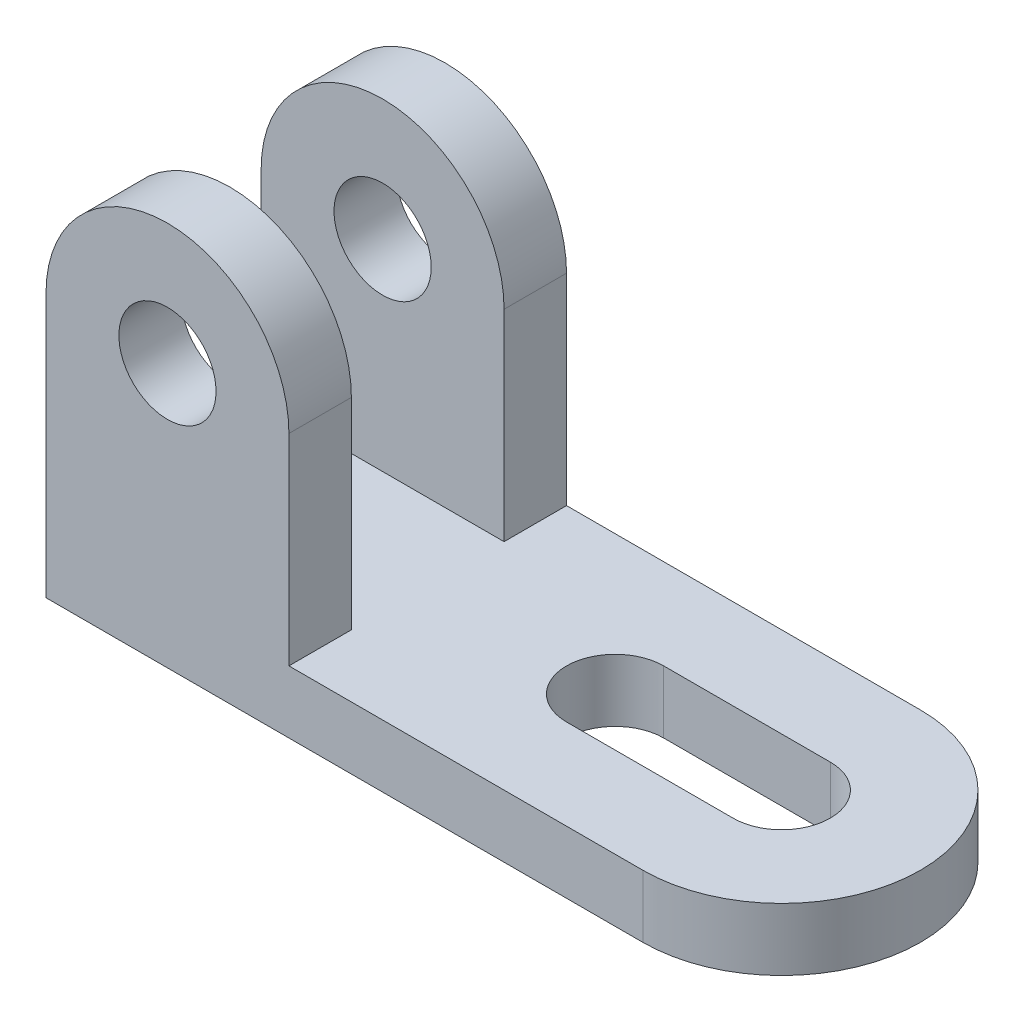
ISO-10303-21;
HEADER;
FILE_DESCRIPTION(('STEP AP214'),'2;1');
FILE_NAME('part.step','',(''),(''),'','','');
FILE_SCHEMA(('AUTOMOTIVE_DESIGN { 1 0 10303 214 1 1 1 1 }'));
ENDSEC;
DATA;
#1=APPLICATION_CONTEXT('core data for automotive mechanical design processes');
#2=APPLICATION_PROTOCOL_DEFINITION('international standard','automotive_design',2000,#1);
#3=PRODUCT_CONTEXT('',#1,'mechanical');
#4=PRODUCT('Part','Part','',(#3));
#5=PRODUCT_RELATED_PRODUCT_CATEGORY('part','',(#4));
#6=PRODUCT_DEFINITION_FORMATION('','',#4);
#7=PRODUCT_DEFINITION_CONTEXT('part definition',#1,'design');
#8=PRODUCT_DEFINITION('design','',#6,#7);
#9=PRODUCT_DEFINITION_SHAPE('','',#8);
#10=(LENGTH_UNIT() NAMED_UNIT(*) SI_UNIT(.MILLI.,.METRE.));
#11=(NAMED_UNIT(*) PLANE_ANGLE_UNIT() SI_UNIT($,.RADIAN.));
#12=(NAMED_UNIT(*) SI_UNIT($,.STERADIAN.) SOLID_ANGLE_UNIT());
#13=UNCERTAINTY_MEASURE_WITH_UNIT(LENGTH_MEASURE(1.E-05),#10,'distance_accuracy_value','');
#14=(GEOMETRIC_REPRESENTATION_CONTEXT(3) GLOBAL_UNCERTAINTY_ASSIGNED_CONTEXT((#13)) GLOBAL_UNIT_ASSIGNED_CONTEXT((#10,
#11,#12)) REPRESENTATION_CONTEXT('',''));
#15=CARTESIAN_POINT('',(0.,0.,0.));
#16=DIRECTION('',(0.,0.,1.));
#17=DIRECTION('',(1.,0.,0.));
#18=AXIS2_PLACEMENT_3D('',#15,#16,#17);
#19=CARTESIAN_POINT('',(0.,9.,0.));
#20=DIRECTION('',(0.,1.,0.));
#21=DIRECTION('',(0.,0.,1.));
#22=AXIS2_PLACEMENT_3D('',#19,#20,#21);
#23=PLANE('',#22);
#24=DIRECTION('',(1.,0.,0.));
#25=VECTOR('',#24,1.);
#26=CARTESIAN_POINT('',(0.,9.,-11.));
#27=LINE('',#26,#25);
#28=CARTESIAN_POINT('',(-86.,9.,-11.));
#29=VERTEX_POINT('',#28);
#30=CARTESIAN_POINT('',(-51.,9.,-11.));
#31=VERTEX_POINT('',#30);
#32=EDGE_CURVE('E188',#29,#31,#27,.T.);
#33=ORIENTED_EDGE('',*,*,#32,.F.);
#34=DIRECTION('',(0.,0.,1.));
#35=VECTOR('',#34,1.);
#36=CARTESIAN_POINT('',(-86.,9.,-20.));
#37=LINE('',#36,#35);
#38=CARTESIAN_POINT('',(-86.,9.,11.));
#39=VERTEX_POINT('',#38);
#40=EDGE_CURVE('E172',#29,#39,#37,.T.);
#41=ORIENTED_EDGE('',*,*,#40,.T.);
#42=DIRECTION('',(-1.,0.,0.));
#43=VECTOR('',#42,1.);
#44=CARTESIAN_POINT('',(0.,9.,11.));
#45=LINE('',#44,#43);
#46=CARTESIAN_POINT('',(-51.,9.,11.));
#47=VERTEX_POINT('',#46);
#48=EDGE_CURVE('E231',#47,#39,#45,.T.);
#49=ORIENTED_EDGE('',*,*,#48,.F.);
#50=DIRECTION('',(0.,0.,-1.));
#51=VECTOR('',#50,1.);
#52=CARTESIAN_POINT('',(-51.,9.,0.));
#53=LINE('',#52,#51);
#54=CARTESIAN_POINT('',(-51.,9.,20.));
#55=VERTEX_POINT('',#54);
#56=EDGE_CURVE('E224',#55,#47,#53,.T.);
#57=ORIENTED_EDGE('',*,*,#56,.F.);
#58=DIRECTION('',(1.,0.,0.));
#59=VECTOR('',#58,1.);
#60=CARTESIAN_POINT('',(0.,9.,20.));
#61=LINE('',#60,#59);
#62=CARTESIAN_POINT('',(0.,9.,20.));
#63=VERTEX_POINT('',#62);
#64=EDGE_CURVE('E287',#55,#63,#61,.T.);
#65=ORIENTED_EDGE('',*,*,#64,.T.);
#66=CARTESIAN_POINT('',(0.,9.,0.));
#67=DIRECTION('',(0.,1.,0.));
#68=DIRECTION('',(0.,0.,1.));
#69=AXIS2_PLACEMENT_3D('',#66,#67,#68);
#70=CIRCLE('',#69,20.);
#71=CARTESIAN_POINT('',(0.,9.,-20.));
#72=VERTEX_POINT('',#71);
#73=EDGE_CURVE('E279',#63,#72,#70,.T.);
#74=ORIENTED_EDGE('',*,*,#73,.T.);
#75=DIRECTION('',(-1.,0.,0.));
#76=VECTOR('',#75,1.);
#77=CARTESIAN_POINT('',(0.,9.,-20.));
#78=LINE('',#77,#76);
#79=CARTESIAN_POINT('',(-51.,9.,-20.));
#80=VERTEX_POINT('',#79);
#81=EDGE_CURVE('E66',#72,#80,#78,.T.);
#82=ORIENTED_EDGE('',*,*,#81,.T.);
#83=DIRECTION('',(0.,0.,1.));
#84=VECTOR('',#83,1.);
#85=CARTESIAN_POINT('',(-51.,9.,0.));
#86=LINE('',#85,#84);
#87=EDGE_CURVE('E61',#80,#31,#86,.T.);
#88=ORIENTED_EDGE('',*,*,#87,.T.);
#89=EDGE_LOOP('',(#33,#41,#49,#57,#65,#74,#82,#88));
#90=FACE_BOUND('',#89,.T.);
#91=DIRECTION('',(1.,0.,0.));
#92=VECTOR('',#91,1.);
#93=CARTESIAN_POINT('',(-24.,9.,7.));
#94=LINE('',#93,#92);
#95=CARTESIAN_POINT('',(-24.,9.,7.));
#96=VERTEX_POINT('',#95);
#97=CARTESIAN_POINT('',(0.,9.,7.));
#98=VERTEX_POINT('',#97);
#99=EDGE_CURVE('E239',#96,#98,#94,.T.);
#100=ORIENTED_EDGE('',*,*,#99,.F.);
#101=CARTESIAN_POINT('',(-24.,9.,0.));
#102=DIRECTION('',(0.,1.,0.));
#103=DIRECTION('',(0.,0.,1.));
#104=AXIS2_PLACEMENT_3D('',#101,#102,#103);
#105=CIRCLE('',#104,7.);
#106=CARTESIAN_POINT('',(-24.,9.,-7.));
#107=VERTEX_POINT('',#106);
#108=EDGE_CURVE('E236',#107,#96,#105,.T.);
#109=ORIENTED_EDGE('',*,*,#108,.F.);
#110=DIRECTION('',(-1.,0.,0.));
#111=VECTOR('',#110,1.);
#112=CARTESIAN_POINT('',(-24.,9.,-7.));
#113=LINE('',#112,#111);
#114=CARTESIAN_POINT('',(0.,9.,-7.));
#115=VERTEX_POINT('',#114);
#116=EDGE_CURVE('E247',#115,#107,#113,.T.);
#117=ORIENTED_EDGE('',*,*,#116,.F.);
#118=CARTESIAN_POINT('',(0.,9.,0.));
#119=DIRECTION('',(0.,1.,0.));
#120=DIRECTION('',(0.,0.,-1.));
#121=AXIS2_PLACEMENT_3D('',#118,#119,#120);
#122=CIRCLE('',#121,7.);
#123=EDGE_CURVE('E243',#98,#115,#122,.T.);
#124=ORIENTED_EDGE('',*,*,#123,.F.);
#125=EDGE_LOOP('',(#100,#109,#117,#124));
#126=FACE_BOUND('',#125,.T.);
#127=ADVANCED_FACE('F45',(#90,#126),#23,.T.);
#128=CARTESIAN_POINT('',(0.,0.,0.));
#129=DIRECTION('',(0.,1.,0.));
#130=DIRECTION('',(0.,0.,1.));
#131=AXIS2_PLACEMENT_3D('',#128,#129,#130);
#132=PLANE('',#131);
#133=DIRECTION('',(1.,0.,0.));
#134=VECTOR('',#133,1.);
#135=CARTESIAN_POINT('',(0.,0.,20.));
#136=LINE('',#135,#134);
#137=CARTESIAN_POINT('',(-86.,0.,20.));
#138=VERTEX_POINT('',#137);
#139=CARTESIAN_POINT('',(0.,0.,20.));
#140=VERTEX_POINT('',#139);
#141=EDGE_CURVE('E282',#138,#140,#136,.T.);
#142=ORIENTED_EDGE('',*,*,#141,.F.);
#143=DIRECTION('',(0.,0.,1.));
#144=VECTOR('',#143,1.);
#145=CARTESIAN_POINT('',(-86.,0.,-20.));
#146=LINE('',#145,#144);
#147=CARTESIAN_POINT('',(-86.,0.,-20.));
#148=VERTEX_POINT('',#147);
#149=EDGE_CURVE('E297',#148,#138,#146,.T.);
#150=ORIENTED_EDGE('',*,*,#149,.F.);
#151=DIRECTION('',(-1.,0.,0.));
#152=VECTOR('',#151,1.);
#153=CARTESIAN_POINT('',(0.,0.,-20.));
#154=LINE('',#153,#152);
#155=CARTESIAN_POINT('',(0.,0.,-20.));
#156=VERTEX_POINT('',#155);
#157=EDGE_CURVE('E294',#156,#148,#154,.T.);
#158=ORIENTED_EDGE('',*,*,#157,.F.);
#159=CARTESIAN_POINT('',(0.,0.,0.));
#160=DIRECTION('',(0.,1.,0.));
#161=DIRECTION('',(0.,0.,1.));
#162=AXIS2_PLACEMENT_3D('',#159,#160,#161);
#163=CIRCLE('',#162,20.);
#164=EDGE_CURVE('E278',#140,#156,#163,.T.);
#165=ORIENTED_EDGE('',*,*,#164,.F.);
#166=EDGE_LOOP('',(#142,#150,#158,#165));
#167=FACE_BOUND('',#166,.T.);
#168=CARTESIAN_POINT('',(-24.,0.,0.));
#169=DIRECTION('',(0.,1.,0.));
#170=DIRECTION('',(0.,0.,1.));
#171=AXIS2_PLACEMENT_3D('',#168,#169,#170);
#172=CIRCLE('',#171,7.);
#173=CARTESIAN_POINT('',(-24.,0.,-7.));
#174=VERTEX_POINT('',#173);
#175=CARTESIAN_POINT('',(-24.,0.,7.));
#176=VERTEX_POINT('',#175);
#177=EDGE_CURVE('E235',#174,#176,#172,.T.);
#178=ORIENTED_EDGE('',*,*,#177,.T.);
#179=DIRECTION('',(1.,0.,0.));
#180=VECTOR('',#179,1.);
#181=CARTESIAN_POINT('',(-24.,0.,7.));
#182=LINE('',#181,#180);
#183=CARTESIAN_POINT('',(0.,0.,7.));
#184=VERTEX_POINT('',#183);
#185=EDGE_CURVE('E254',#176,#184,#182,.T.);
#186=ORIENTED_EDGE('',*,*,#185,.T.);
#187=CARTESIAN_POINT('',(0.,0.,0.));
#188=DIRECTION('',(0.,1.,0.));
#189=DIRECTION('',(0.,0.,-1.));
#190=AXIS2_PLACEMENT_3D('',#187,#188,#189);
#191=CIRCLE('',#190,7.);
#192=CARTESIAN_POINT('',(0.,0.,-7.));
#193=VERTEX_POINT('',#192);
#194=EDGE_CURVE('E258',#184,#193,#191,.T.);
#195=ORIENTED_EDGE('',*,*,#194,.T.);
#196=DIRECTION('',(-1.,0.,0.));
#197=VECTOR('',#196,1.);
#198=CARTESIAN_POINT('',(-24.,0.,-7.));
#199=LINE('',#198,#197);
#200=EDGE_CURVE('E240',#193,#174,#199,.T.);
#201=ORIENTED_EDGE('',*,*,#200,.T.);
#202=EDGE_LOOP('',(#178,#186,#195,#201));
#203=FACE_BOUND('',#202,.T.);
#204=ADVANCED_FACE('F313',(#167,#203),#132,.F.);
#205=CARTESIAN_POINT('',(0.,9.,0.));
#206=DIRECTION('',(0.,-1.,0.));
#207=DIRECTION('',(0.,0.,-1.));
#208=AXIS2_PLACEMENT_3D('',#205,#206,#207);
#209=CYLINDRICAL_SURFACE('',#208,20.);
#210=ORIENTED_EDGE('',*,*,#164,.T.);
#211=DIRECTION('',(0.,-1.,0.));
#212=VECTOR('',#211,1.);
#213=CARTESIAN_POINT('',(0.,9.,-20.));
#214=LINE('',#213,#212);
#215=EDGE_CURVE('E11',#72,#156,#214,.T.);
#216=ORIENTED_EDGE('',*,*,#215,.F.);
#217=ORIENTED_EDGE('',*,*,#73,.F.);
#218=DIRECTION('',(0.,-1.,0.));
#219=VECTOR('',#218,1.);
#220=CARTESIAN_POINT('',(0.,9.,20.));
#221=LINE('',#220,#219);
#222=EDGE_CURVE('E290',#63,#140,#221,.T.);
#223=ORIENTED_EDGE('',*,*,#222,.T.);
#224=EDGE_LOOP('',(#210,#216,#217,#223));
#225=FACE_BOUND('',#224,.T.);
#226=ADVANCED_FACE('F47',(#225),#209,.T.);
#227=CARTESIAN_POINT('',(0.,9.,-20.));
#228=DIRECTION('',(0.,0.,1.));
#229=DIRECTION('',(1.,0.,0.));
#230=AXIS2_PLACEMENT_3D('',#227,#228,#229);
#231=PLANE('',#230);
#232=DIRECTION('',(0.,-1.,0.));
#233=VECTOR('',#232,1.);
#234=CARTESIAN_POINT('',(-86.,9.,-20.));
#235=LINE('',#234,#233);
#236=CARTESIAN_POINT('',(-86.,38.,-20.));
#237=VERTEX_POINT('',#236);
#238=EDGE_CURVE('E54',#237,#148,#235,.T.);
#239=ORIENTED_EDGE('',*,*,#238,.F.);
#240=CARTESIAN_POINT('',(-68.5,38.,-20.));
#241=DIRECTION('',(0.,0.,1.));
#242=DIRECTION('',(-1.,0.,0.));
#243=AXIS2_PLACEMENT_3D('',#240,#241,#242);
#244=CIRCLE('',#243,17.5);
#245=CARTESIAN_POINT('',(-51.,38.,-20.));
#246=VERTEX_POINT('',#245);
#247=EDGE_CURVE('E164',#246,#237,#244,.T.);
#248=ORIENTED_EDGE('',*,*,#247,.F.);
#249=DIRECTION('',(0.,1.,0.));
#250=VECTOR('',#249,1.);
#251=CARTESIAN_POINT('',(-51.,38.,-20.));
#252=LINE('',#251,#250);
#253=EDGE_CURVE('E174',#80,#246,#252,.T.);
#254=ORIENTED_EDGE('',*,*,#253,.F.);
#255=ORIENTED_EDGE('',*,*,#81,.F.);
#256=ORIENTED_EDGE('',*,*,#215,.T.);
#257=ORIENTED_EDGE('',*,*,#157,.T.);
#258=EDGE_LOOP('',(#239,#248,#254,#255,#256,#257));
#259=FACE_BOUND('',#258,.T.);
#260=CARTESIAN_POINT('',(-68.5,38.,-20.));
#261=DIRECTION('',(0.,0.,1.));
#262=DIRECTION('',(1.,0.,0.));
#263=AXIS2_PLACEMENT_3D('',#260,#261,#262);
#264=CIRCLE('',#263,7.);
#265=CARTESIAN_POINT('',(-61.5,38.,-20.));
#266=VERTEX_POINT('',#265);
#267=EDGE_CURVE('E179',#266,#266,#264,.T.);
#268=ORIENTED_EDGE('',*,*,#267,.T.);
#269=EDGE_LOOP('',(#268));
#270=FACE_BOUND('',#269,.T.);
#271=ADVANCED_FACE('F340',(#259,#270),#231,.F.);
#272=CARTESIAN_POINT('',(-86.,9.,-20.));
#273=DIRECTION('',(1.,0.,0.));
#274=DIRECTION('',(0.,0.,-1.));
#275=AXIS2_PLACEMENT_3D('',#272,#273,#274);
#276=PLANE('',#275);
#277=ORIENTED_EDGE('',*,*,#40,.F.);
#278=DIRECTION('',(0.,-1.,0.));
#279=VECTOR('',#278,1.);
#280=CARTESIAN_POINT('',(-86.,0.,-11.));
#281=LINE('',#280,#279);
#282=CARTESIAN_POINT('',(-86.,38.,-11.));
#283=VERTEX_POINT('',#282);
#284=EDGE_CURVE('E151',#283,#29,#281,.T.);
#285=ORIENTED_EDGE('',*,*,#284,.F.);
#286=DIRECTION('',(0.,0.,-1.));
#287=VECTOR('',#286,1.);
#288=CARTESIAN_POINT('',(-86.,38.,-11.));
#289=LINE('',#288,#287);
#290=EDGE_CURVE('E161',#283,#237,#289,.T.);
#291=ORIENTED_EDGE('',*,*,#290,.T.);
#292=ORIENTED_EDGE('',*,*,#238,.T.);
#293=ORIENTED_EDGE('',*,*,#149,.T.);
#294=DIRECTION('',(0.,-1.,0.));
#295=VECTOR('',#294,1.);
#296=CARTESIAN_POINT('',(-86.,9.,20.));
#297=LINE('',#296,#295);
#298=CARTESIAN_POINT('',(-86.,38.,20.));
#299=VERTEX_POINT('',#298);
#300=EDGE_CURVE('E305',#299,#138,#297,.T.);
#301=ORIENTED_EDGE('',*,*,#300,.F.);
#302=DIRECTION('',(0.,0.,1.));
#303=VECTOR('',#302,1.);
#304=CARTESIAN_POINT('',(-86.,38.,11.));
#305=LINE('',#304,#303);
#306=CARTESIAN_POINT('',(-86.,38.,11.));
#307=VERTEX_POINT('',#306);
#308=EDGE_CURVE('E220',#307,#299,#305,.T.);
#309=ORIENTED_EDGE('',*,*,#308,.F.);
#310=DIRECTION('',(0.,-1.,0.));
#311=VECTOR('',#310,1.);
#312=CARTESIAN_POINT('',(-86.,0.,11.));
#313=LINE('',#312,#311);
#314=EDGE_CURVE('E211',#307,#39,#313,.T.);
#315=ORIENTED_EDGE('',*,*,#314,.T.);
#316=EDGE_LOOP('',(#277,#285,#291,#292,#293,#301,#309,#315));
#317=FACE_BOUND('',#316,.T.);
#318=ADVANCED_FACE('F170',(#317),#276,.F.);
#319=CARTESIAN_POINT('',(0.,9.,20.));
#320=DIRECTION('',(0.,0.,-1.));
#321=DIRECTION('',(-1.,0.,0.));
#322=AXIS2_PLACEMENT_3D('',#319,#320,#321);
#323=PLANE('',#322);
#324=ORIENTED_EDGE('',*,*,#64,.F.);
#325=DIRECTION('',(0.,1.,0.));
#326=VECTOR('',#325,1.);
#327=CARTESIAN_POINT('',(-51.,38.,20.));
#328=LINE('',#327,#326);
#329=CARTESIAN_POINT('',(-51.,38.,20.));
#330=VERTEX_POINT('',#329);
#331=EDGE_CURVE('E199',#55,#330,#328,.T.);
#332=ORIENTED_EDGE('',*,*,#331,.T.);
#333=CARTESIAN_POINT('',(-68.5,38.,20.));
#334=DIRECTION('',(0.,0.,1.));
#335=DIRECTION('',(-1.,0.,0.));
#336=AXIS2_PLACEMENT_3D('',#333,#334,#335);
#337=CIRCLE('',#336,17.5);
#338=EDGE_CURVE('E207',#330,#299,#337,.T.);
#339=ORIENTED_EDGE('',*,*,#338,.T.);
#340=ORIENTED_EDGE('',*,*,#300,.T.);
#341=ORIENTED_EDGE('',*,*,#141,.T.);
#342=ORIENTED_EDGE('',*,*,#222,.F.);
#343=EDGE_LOOP('',(#324,#332,#339,#340,#341,#342));
#344=FACE_BOUND('',#343,.T.);
#345=CARTESIAN_POINT('',(-68.5,38.,20.));
#346=DIRECTION('',(0.,0.,1.));
#347=DIRECTION('',(1.,0.,0.));
#348=AXIS2_PLACEMENT_3D('',#345,#346,#347);
#349=CIRCLE('',#348,7.);
#350=CARTESIAN_POINT('',(-61.5,38.,20.));
#351=VERTEX_POINT('',#350);
#352=EDGE_CURVE('E194',#351,#351,#349,.T.);
#353=ORIENTED_EDGE('',*,*,#352,.F.);
#354=EDGE_LOOP('',(#353));
#355=FACE_BOUND('',#354,.T.);
#356=ADVANCED_FACE('F318',(#344,#355),#323,.F.);
#357=CARTESIAN_POINT('',(-24.,9.,0.));
#358=DIRECTION('',(0.,-1.,0.));
#359=DIRECTION('',(0.,0.,-1.));
#360=AXIS2_PLACEMENT_3D('',#357,#358,#359);
#361=CYLINDRICAL_SURFACE('',#360,7.);
#362=ORIENTED_EDGE('',*,*,#177,.F.);
#363=DIRECTION('',(0.,-1.,0.));
#364=VECTOR('',#363,1.);
#365=CARTESIAN_POINT('',(-24.,9.,-7.));
#366=LINE('',#365,#364);
#367=EDGE_CURVE('E250',#107,#174,#366,.T.);
#368=ORIENTED_EDGE('',*,*,#367,.F.);
#369=ORIENTED_EDGE('',*,*,#108,.T.);
#370=DIRECTION('',(0.,-1.,0.));
#371=VECTOR('',#370,1.);
#372=CARTESIAN_POINT('',(-24.,9.,7.));
#373=LINE('',#372,#371);
#374=EDGE_CURVE('E274',#96,#176,#373,.T.);
#375=ORIENTED_EDGE('',*,*,#374,.T.);
#376=EDGE_LOOP('',(#362,#368,#369,#375));
#377=FACE_BOUND('',#376,.T.);
#378=ADVANCED_FACE('F371',(#377),#361,.F.);
#379=CARTESIAN_POINT('',(-24.,9.,7.));
#380=DIRECTION('',(0.,0.,-1.));
#381=DIRECTION('',(-1.,0.,0.));
#382=AXIS2_PLACEMENT_3D('',#379,#380,#381);
#383=PLANE('',#382);
#384=ORIENTED_EDGE('',*,*,#185,.F.);
#385=ORIENTED_EDGE('',*,*,#374,.F.);
#386=ORIENTED_EDGE('',*,*,#99,.T.);
#387=DIRECTION('',(0.,-1.,0.));
#388=VECTOR('',#387,1.);
#389=CARTESIAN_POINT('',(0.,9.,7.));
#390=LINE('',#389,#388);
#391=EDGE_CURVE('E271',#98,#184,#390,.T.);
#392=ORIENTED_EDGE('',*,*,#391,.T.);
#393=EDGE_LOOP('',(#384,#385,#386,#392));
#394=FACE_BOUND('',#393,.T.);
#395=ADVANCED_FACE('F430',(#394),#383,.T.);
#396=CARTESIAN_POINT('',(0.,9.,0.));
#397=DIRECTION('',(0.,-1.,0.));
#398=DIRECTION('',(0.,0.,-1.));
#399=AXIS2_PLACEMENT_3D('',#396,#397,#398);
#400=CYLINDRICAL_SURFACE('',#399,7.);
#401=ORIENTED_EDGE('',*,*,#194,.F.);
#402=ORIENTED_EDGE('',*,*,#391,.F.);
#403=ORIENTED_EDGE('',*,*,#123,.T.);
#404=DIRECTION('',(0.,-1.,0.));
#405=VECTOR('',#404,1.);
#406=CARTESIAN_POINT('',(0.,9.,-7.));
#407=LINE('',#406,#405);
#408=EDGE_CURVE('E268',#115,#193,#407,.T.);
#409=ORIENTED_EDGE('',*,*,#408,.T.);
#410=EDGE_LOOP('',(#401,#402,#403,#409));
#411=FACE_BOUND('',#410,.T.);
#412=ADVANCED_FACE('F439',(#411),#400,.F.);
#413=CARTESIAN_POINT('',(-24.,9.,-7.));
#414=DIRECTION('',(0.,0.,1.));
#415=DIRECTION('',(1.,0.,0.));
#416=AXIS2_PLACEMENT_3D('',#413,#414,#415);
#417=PLANE('',#416);
#418=ORIENTED_EDGE('',*,*,#200,.F.);
#419=ORIENTED_EDGE('',*,*,#408,.F.);
#420=ORIENTED_EDGE('',*,*,#116,.T.);
#421=ORIENTED_EDGE('',*,*,#367,.T.);
#422=EDGE_LOOP('',(#418,#419,#420,#421));
#423=FACE_BOUND('',#422,.T.);
#424=ADVANCED_FACE('F447',(#423),#417,.T.);
#425=CARTESIAN_POINT('',(-68.5,38.,11.));
#426=DIRECTION('',(0.,0.,1.));
#427=DIRECTION('',(1.,0.,0.));
#428=AXIS2_PLACEMENT_3D('',#425,#426,#427);
#429=CYLINDRICAL_SURFACE('',#428,17.5);
#430=ORIENTED_EDGE('',*,*,#338,.F.);
#431=DIRECTION('',(0.,0.,1.));
#432=VECTOR('',#431,1.);
#433=CARTESIAN_POINT('',(-51.,38.,11.));
#434=LINE('',#433,#432);
#435=CARTESIAN_POINT('',(-51.,38.,11.));
#436=VERTEX_POINT('',#435);
#437=EDGE_CURVE('E214',#436,#330,#434,.T.);
#438=ORIENTED_EDGE('',*,*,#437,.F.);
#439=CARTESIAN_POINT('',(-68.5,38.,11.));
#440=DIRECTION('',(0.,0.,1.));
#441=DIRECTION('',(-1.,0.,0.));
#442=AXIS2_PLACEMENT_3D('',#439,#440,#441);
#443=CIRCLE('',#442,17.5);
#444=EDGE_CURVE('E206',#436,#307,#443,.T.);
#445=ORIENTED_EDGE('',*,*,#444,.T.);
#446=ORIENTED_EDGE('',*,*,#308,.T.);
#447=EDGE_LOOP('',(#430,#438,#445,#446));
#448=FACE_BOUND('',#447,.T.);
#449=ADVANCED_FACE('F333',(#448),#429,.T.);
#450=CARTESIAN_POINT('',(-51.,38.,11.));
#451=DIRECTION('',(1.,0.,0.));
#452=DIRECTION('',(0.,1.,0.));
#453=AXIS2_PLACEMENT_3D('',#450,#451,#452);
#454=PLANE('',#453);
#455=ORIENTED_EDGE('',*,*,#331,.F.);
#456=ORIENTED_EDGE('',*,*,#56,.T.);
#457=DIRECTION('',(0.,1.,0.));
#458=VECTOR('',#457,1.);
#459=CARTESIAN_POINT('',(-51.,38.,11.));
#460=LINE('',#459,#458);
#461=EDGE_CURVE('E203',#47,#436,#460,.T.);
#462=ORIENTED_EDGE('',*,*,#461,.T.);
#463=ORIENTED_EDGE('',*,*,#437,.T.);
#464=EDGE_LOOP('',(#455,#456,#462,#463));
#465=FACE_BOUND('',#464,.T.);
#466=ADVANCED_FACE('F329',(#465),#454,.T.);
#467=CARTESIAN_POINT('',(-68.5,38.,11.));
#468=DIRECTION('',(0.,0.,-1.));
#469=DIRECTION('',(-1.,0.,0.));
#470=AXIS2_PLACEMENT_3D('',#467,#468,#469);
#471=PLANE('',#470);
#472=CARTESIAN_POINT('',(-68.5,38.,11.));
#473=DIRECTION('',(0.,0.,1.));
#474=DIRECTION('',(1.,0.,0.));
#475=AXIS2_PLACEMENT_3D('',#472,#473,#474);
#476=CIRCLE('',#475,7.);
#477=CARTESIAN_POINT('',(-61.5,38.,11.));
#478=VERTEX_POINT('',#477);
#479=EDGE_CURVE('E195',#478,#478,#476,.T.);
#480=ORIENTED_EDGE('',*,*,#479,.T.);
#481=EDGE_LOOP('',(#480));
#482=FACE_BOUND('',#481,.T.);
#483=ORIENTED_EDGE('',*,*,#461,.F.);
#484=ORIENTED_EDGE('',*,*,#48,.T.);
#485=ORIENTED_EDGE('',*,*,#314,.F.);
#486=ORIENTED_EDGE('',*,*,#444,.F.);
#487=EDGE_LOOP('',(#483,#484,#485,#486));
#488=FACE_BOUND('',#487,.T.);
#489=ADVANCED_FACE('F336',(#482,#488),#471,.T.);
#490=CARTESIAN_POINT('',(-68.5,38.,11.));
#491=DIRECTION('',(0.,0.,1.));
#492=DIRECTION('',(1.,0.,0.));
#493=AXIS2_PLACEMENT_3D('',#490,#491,#492);
#494=CYLINDRICAL_SURFACE('',#493,7.);
#495=ORIENTED_EDGE('',*,*,#479,.F.);
#496=EDGE_LOOP('',(#495));
#497=FACE_BOUND('',#496,.T.);
#498=ORIENTED_EDGE('',*,*,#352,.T.);
#499=EDGE_LOOP('',(#498));
#500=FACE_BOUND('',#499,.T.);
#501=ADVANCED_FACE('F353',(#497,#500),#494,.F.);
#502=CARTESIAN_POINT('',(-68.5,38.,-11.));
#503=DIRECTION('',(0.,0.,1.));
#504=DIRECTION('',(-1.,0.,0.));
#505=AXIS2_PLACEMENT_3D('',#502,#503,#504);
#506=PLANE('',#505);
#507=ORIENTED_EDGE('',*,*,#284,.T.);
#508=ORIENTED_EDGE('',*,*,#32,.T.);
#509=DIRECTION('',(0.,1.,0.));
#510=VECTOR('',#509,1.);
#511=CARTESIAN_POINT('',(-51.,38.,-11.));
#512=LINE('',#511,#510);
#513=CARTESIAN_POINT('',(-51.,38.,-11.));
#514=VERTEX_POINT('',#513);
#515=EDGE_CURVE('E153',#31,#514,#512,.T.);
#516=ORIENTED_EDGE('',*,*,#515,.T.);
#517=CARTESIAN_POINT('',(-68.5,38.,-11.));
#518=DIRECTION('',(0.,0.,1.));
#519=DIRECTION('',(-1.,0.,0.));
#520=AXIS2_PLACEMENT_3D('',#517,#518,#519);
#521=CIRCLE('',#520,17.5);
#522=EDGE_CURVE('E146',#514,#283,#521,.T.);
#523=ORIENTED_EDGE('',*,*,#522,.T.);
#524=EDGE_LOOP('',(#507,#508,#516,#523));
#525=FACE_BOUND('',#524,.T.);
#526=CARTESIAN_POINT('',(-68.5,38.,-11.));
#527=DIRECTION('',(0.,0.,1.));
#528=DIRECTION('',(1.,0.,0.));
#529=AXIS2_PLACEMENT_3D('',#526,#527,#528);
#530=CIRCLE('',#529,7.);
#531=CARTESIAN_POINT('',(-61.5,38.,-11.));
#532=VERTEX_POINT('',#531);
#533=EDGE_CURVE('E185',#532,#532,#530,.T.);
#534=ORIENTED_EDGE('',*,*,#533,.F.);
#535=EDGE_LOOP('',(#534));
#536=FACE_BOUND('',#535,.T.);
#537=ADVANCED_FACE('F148',(#525,#536),#506,.T.);
#538=CARTESIAN_POINT('',(-51.,38.,-11.));
#539=DIRECTION('',(-1.,0.,0.));
#540=DIRECTION('',(0.,-1.,0.));
#541=AXIS2_PLACEMENT_3D('',#538,#539,#540);
#542=PLANE('',#541);
#543=ORIENTED_EDGE('',*,*,#87,.F.);
#544=ORIENTED_EDGE('',*,*,#253,.T.);
#545=DIRECTION('',(0.,0.,-1.));
#546=VECTOR('',#545,1.);
#547=CARTESIAN_POINT('',(-51.,38.,-11.));
#548=LINE('',#547,#546);
#549=EDGE_CURVE('E168',#514,#246,#548,.T.);
#550=ORIENTED_EDGE('',*,*,#549,.F.);
#551=ORIENTED_EDGE('',*,*,#515,.F.);
#552=EDGE_LOOP('',(#543,#544,#550,#551));
#553=FACE_BOUND('',#552,.T.);
#554=ADVANCED_FACE('F338',(#553),#542,.F.);
#555=CARTESIAN_POINT('',(-68.5,38.,-11.));
#556=DIRECTION('',(0.,0.,-1.));
#557=DIRECTION('',(-1.,0.,0.));
#558=AXIS2_PLACEMENT_3D('',#555,#556,#557);
#559=CYLINDRICAL_SURFACE('',#558,17.5);
#560=ORIENTED_EDGE('',*,*,#247,.T.);
#561=ORIENTED_EDGE('',*,*,#290,.F.);
#562=ORIENTED_EDGE('',*,*,#522,.F.);
#563=ORIENTED_EDGE('',*,*,#549,.T.);
#564=EDGE_LOOP('',(#560,#561,#562,#563));
#565=FACE_BOUND('',#564,.T.);
#566=ADVANCED_FACE('F162',(#565),#559,.T.);
#567=CARTESIAN_POINT('',(-68.5,38.,-11.));
#568=DIRECTION('',(0.,0.,-1.));
#569=DIRECTION('',(-1.,0.,0.));
#570=AXIS2_PLACEMENT_3D('',#567,#568,#569);
#571=CYLINDRICAL_SURFACE('',#570,7.);
#572=ORIENTED_EDGE('',*,*,#533,.T.);
#573=EDGE_LOOP('',(#572));
#574=FACE_BOUND('',#573,.T.);
#575=ORIENTED_EDGE('',*,*,#267,.F.);
#576=EDGE_LOOP('',(#575));
#577=FACE_BOUND('',#576,.T.);
#578=ADVANCED_FACE('F351',(#574,#577),#571,.F.);
#579=CLOSED_SHELL('',(#127,#204,#226,#271,#318,#356,#378,#395,#412,#424,#449,#466,#489,#501,
#537,#554,#566,#578));
#580=MANIFOLD_SOLID_BREP('B2',#579);
#581=ADVANCED_BREP_SHAPE_REPRESENTATION('',(#18,#580),#14);
#582=SHAPE_DEFINITION_REPRESENTATION(#9,#581);
ENDSEC;
END-ISO-10303-21;
